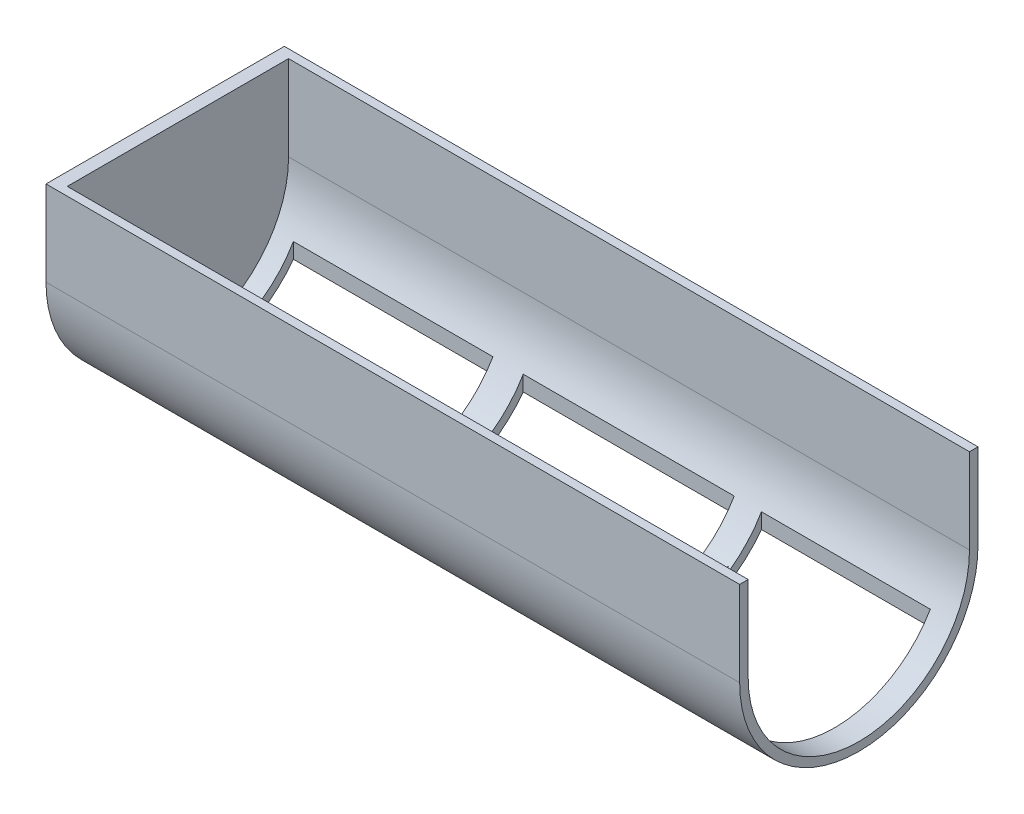
ISO-10303-21;
HEADER;
FILE_DESCRIPTION(('STEP AP214'),'2;1');
FILE_NAME('part.step','',(''),(''),'','','');
FILE_SCHEMA(('AUTOMOTIVE_DESIGN { 1 0 10303 214 1 1 1 1 }'));
ENDSEC;
DATA;
#1=APPLICATION_CONTEXT('core data for automotive mechanical design processes');
#2=APPLICATION_PROTOCOL_DEFINITION('international standard','automotive_design',2000,#1);
#3=PRODUCT_CONTEXT('',#1,'mechanical');
#4=PRODUCT('Part','Part','',(#3));
#5=PRODUCT_RELATED_PRODUCT_CATEGORY('part','',(#4));
#6=PRODUCT_DEFINITION_FORMATION('','',#4);
#7=PRODUCT_DEFINITION_CONTEXT('part definition',#1,'design');
#8=PRODUCT_DEFINITION('design','',#6,#7);
#9=PRODUCT_DEFINITION_SHAPE('','',#8);
#10=(LENGTH_UNIT() NAMED_UNIT(*) SI_UNIT(.MILLI.,.METRE.));
#11=(NAMED_UNIT(*) PLANE_ANGLE_UNIT() SI_UNIT($,.RADIAN.));
#12=(NAMED_UNIT(*) SI_UNIT($,.STERADIAN.) SOLID_ANGLE_UNIT());
#13=UNCERTAINTY_MEASURE_WITH_UNIT(LENGTH_MEASURE(1.E-05),#10,'distance_accuracy_value','');
#14=(GEOMETRIC_REPRESENTATION_CONTEXT(3) GLOBAL_UNCERTAINTY_ASSIGNED_CONTEXT((#13)) GLOBAL_UNIT_ASSIGNED_CONTEXT((#10,
#11,#12)) REPRESENTATION_CONTEXT('',''));
#15=CARTESIAN_POINT('',(0.,0.,0.));
#16=DIRECTION('',(0.,0.,1.));
#17=DIRECTION('',(1.,0.,0.));
#18=AXIS2_PLACEMENT_3D('',#15,#16,#17);
#19=CARTESIAN_POINT('',(160.,20.,-28.));
#20=DIRECTION('',(0.,0.,1.));
#21=DIRECTION('',(0.,-1.,0.));
#22=AXIS2_PLACEMENT_3D('',#19,#20,#21);
#23=PLANE('',#22);
#24=DIRECTION('',(-1.,0.,0.));
#25=VECTOR('',#24,1.);
#26=CARTESIAN_POINT('',(160.,0.,-28.));
#27=LINE('',#26,#25);
#28=CARTESIAN_POINT('',(160.,0.,-28.));
#29=VERTEX_POINT('',#28);
#30=CARTESIAN_POINT('',(-3.,0.,-28.));
#31=VERTEX_POINT('',#30);
#32=EDGE_CURVE('E345',#29,#31,#27,.T.);
#33=ORIENTED_EDGE('',*,*,#32,.T.);
#34=DIRECTION('',(0.,-1.,0.));
#35=VECTOR('',#34,1.);
#36=CARTESIAN_POINT('',(-3.,20.,-28.));
#37=LINE('',#36,#35);
#38=CARTESIAN_POINT('',(-3.,20.,-28.));
#39=VERTEX_POINT('',#38);
#40=EDGE_CURVE('E295',#39,#31,#37,.T.);
#41=ORIENTED_EDGE('',*,*,#40,.F.);
#42=DIRECTION('',(-1.,0.,0.));
#43=VECTOR('',#42,1.);
#44=CARTESIAN_POINT('',(160.,20.,-28.));
#45=LINE('',#44,#43);
#46=CARTESIAN_POINT('',(160.,20.,-28.));
#47=VERTEX_POINT('',#46);
#48=EDGE_CURVE('E307',#47,#39,#45,.T.);
#49=ORIENTED_EDGE('',*,*,#48,.F.);
#50=DIRECTION('',(0.,-1.,0.));
#51=VECTOR('',#50,1.);
#52=CARTESIAN_POINT('',(160.,20.,-28.));
#53=LINE('',#52,#51);
#54=EDGE_CURVE('E314',#47,#29,#53,.T.);
#55=ORIENTED_EDGE('',*,*,#54,.T.);
#56=EDGE_LOOP('',(#33,#41,#49,#55));
#57=FACE_BOUND('',#56,.T.);
#58=ADVANCED_FACE('F39',(#57),#23,.F.);
#59=CARTESIAN_POINT('',(0.,20.,-26.));
#60=DIRECTION('',(0.,0.,-1.));
#61=DIRECTION('',(0.,1.,0.));
#62=AXIS2_PLACEMENT_3D('',#59,#60,#61);
#63=PLANE('',#62);
#64=DIRECTION('',(-1.,0.,0.));
#65=VECTOR('',#64,1.);
#66=CARTESIAN_POINT('',(160.,0.,-26.));
#67=LINE('',#66,#65);
#68=CARTESIAN_POINT('',(160.,0.,-26.));
#69=VERTEX_POINT('',#68);
#70=CARTESIAN_POINT('',(0.,0.,-26.));
#71=VERTEX_POINT('',#70);
#72=EDGE_CURVE('E341',#69,#71,#67,.T.);
#73=ORIENTED_EDGE('',*,*,#72,.F.);
#74=DIRECTION('',(0.,-1.,0.));
#75=VECTOR('',#74,1.);
#76=CARTESIAN_POINT('',(160.,20.,-26.));
#77=LINE('',#76,#75);
#78=CARTESIAN_POINT('',(160.,20.,-26.));
#79=VERTEX_POINT('',#78);
#80=EDGE_CURVE('E320',#79,#69,#77,.T.);
#81=ORIENTED_EDGE('',*,*,#80,.F.);
#82=DIRECTION('',(1.,0.,0.));
#83=VECTOR('',#82,1.);
#84=CARTESIAN_POINT('',(0.,20.,-26.));
#85=LINE('',#84,#83);
#86=CARTESIAN_POINT('',(0.,20.,-26.));
#87=VERTEX_POINT('',#86);
#88=EDGE_CURVE('E310',#87,#79,#85,.T.);
#89=ORIENTED_EDGE('',*,*,#88,.F.);
#90=DIRECTION('',(0.,-1.,0.));
#91=VECTOR('',#90,1.);
#92=CARTESIAN_POINT('',(0.,20.,-26.));
#93=LINE('',#92,#91);
#94=EDGE_CURVE('E319',#87,#71,#93,.T.);
#95=ORIENTED_EDGE('',*,*,#94,.T.);
#96=EDGE_LOOP('',(#73,#81,#89,#95));
#97=FACE_BOUND('',#96,.T.);
#98=ADVANCED_FACE('F378',(#97),#63,.F.);
#99=CARTESIAN_POINT('',(0.,20.,0.));
#100=DIRECTION('',(0.,1.,0.));
#101=DIRECTION('',(0.,0.,1.));
#102=AXIS2_PLACEMENT_3D('',#99,#100,#101);
#103=PLANE('',#102);
#104=ORIENTED_EDGE('',*,*,#48,.T.);
#105=DIRECTION('',(0.,0.,-1.));
#106=VECTOR('',#105,1.);
#107=CARTESIAN_POINT('',(-3.,20.,-28.));
#108=LINE('',#107,#106);
#109=CARTESIAN_POINT('',(-3.,20.,28.));
#110=VERTEX_POINT('',#109);
#111=EDGE_CURVE('E301',#110,#39,#108,.T.);
#112=ORIENTED_EDGE('',*,*,#111,.F.);
#113=DIRECTION('',(1.,0.,0.));
#114=VECTOR('',#113,1.);
#115=CARTESIAN_POINT('',(0.,20.,28.));
#116=LINE('',#115,#114);
#117=CARTESIAN_POINT('',(160.,20.,28.));
#118=VERTEX_POINT('',#117);
#119=EDGE_CURVE('E331',#110,#118,#116,.T.);
#120=ORIENTED_EDGE('',*,*,#119,.T.);
#121=DIRECTION('',(0.,0.,-1.));
#122=VECTOR('',#121,1.);
#123=CARTESIAN_POINT('',(160.,20.,28.));
#124=LINE('',#123,#122);
#125=CARTESIAN_POINT('',(160.,20.,26.));
#126=VERTEX_POINT('',#125);
#127=EDGE_CURVE('E335',#118,#126,#124,.T.);
#128=ORIENTED_EDGE('',*,*,#127,.T.);
#129=DIRECTION('',(-1.,0.,0.));
#130=VECTOR('',#129,1.);
#131=CARTESIAN_POINT('',(160.,20.,26.));
#132=LINE('',#131,#130);
#133=CARTESIAN_POINT('',(0.,20.,26.));
#134=VERTEX_POINT('',#133);
#135=EDGE_CURVE('E309',#126,#134,#132,.T.);
#136=ORIENTED_EDGE('',*,*,#135,.T.);
#137=DIRECTION('',(0.,0.,-1.));
#138=VECTOR('',#137,1.);
#139=CARTESIAN_POINT('',(0.,20.,-28.));
#140=LINE('',#139,#138);
#141=EDGE_CURVE('E292',#134,#87,#140,.T.);
#142=ORIENTED_EDGE('',*,*,#141,.T.);
#143=ORIENTED_EDGE('',*,*,#88,.T.);
#144=DIRECTION('',(0.,0.,-1.));
#145=VECTOR('',#144,1.);
#146=CARTESIAN_POINT('',(160.,20.,-26.));
#147=LINE('',#146,#145);
#148=EDGE_CURVE('E315',#79,#47,#147,.T.);
#149=ORIENTED_EDGE('',*,*,#148,.T.);
#150=EDGE_LOOP('',(#104,#112,#120,#128,#136,#142,#143,#149));
#151=FACE_BOUND('',#150,.T.);
#152=ADVANCED_FACE('F359',(#151),#103,.T.);
#153=CARTESIAN_POINT('',(160.,0.,0.));
#154=DIRECTION('',(-1.,0.,0.));
#155=DIRECTION('',(0.,0.,1.));
#156=AXIS2_PLACEMENT_3D('',#153,#154,#155);
#157=CYLINDRICAL_SURFACE('',#156,26.);
#158=DIRECTION('',(-1.,0.,0.));
#159=VECTOR('',#158,1.);
#160=CARTESIAN_POINT('',(160.,-17.7523013973817,18.9962047550694));
#161=LINE('',#160,#159);
#162=CARTESIAN_POINT('',(51.5610081041127,-17.7523013973817,18.9962047550694));
#163=VERTEX_POINT('',#162);
#164=CARTESIAN_POINT('',(4.67329362693053,-17.7523013973817,18.9962047550694));
#165=VERTEX_POINT('',#164);
#166=EDGE_CURVE('E285',#163,#165,#161,.T.);
#167=ORIENTED_EDGE('',*,*,#166,.T.);
#168=CARTESIAN_POINT('',(4.67329362693053,0.,0.));
#169=DIRECTION('',(-1.,0.,0.));
#170=DIRECTION('',(0.,0.,1.));
#171=AXIS2_PLACEMENT_3D('',#168,#169,#170);
#172=CIRCLE('',#171,26.);
#173=CARTESIAN_POINT('',(4.67329362693053,-13.1088285569375,-22.4534766542916));
#174=VERTEX_POINT('',#173);
#175=EDGE_CURVE('E288',#165,#174,#172,.F.);
#176=ORIENTED_EDGE('',*,*,#175,.T.);
#177=DIRECTION('',(-1.,0.,0.));
#178=VECTOR('',#177,1.);
#179=CARTESIAN_POINT('',(160.,-13.1088285569375,-22.4534766542916));
#180=LINE('',#179,#178);
#181=CARTESIAN_POINT('',(51.5610081041127,-13.1088285569375,-22.4534766542916));
#182=VERTEX_POINT('',#181);
#183=EDGE_CURVE('E240',#174,#182,#180,.F.);
#184=ORIENTED_EDGE('',*,*,#183,.T.);
#185=CARTESIAN_POINT('',(51.5610081041127,0.,0.));
#186=DIRECTION('',(1.,0.,0.));
#187=DIRECTION('',(0.,0.,-1.));
#188=AXIS2_PLACEMENT_3D('',#185,#186,#187);
#189=CIRCLE('',#188,26.);
#190=EDGE_CURVE('E282',#182,#163,#189,.F.);
#191=ORIENTED_EDGE('',*,*,#190,.T.);
#192=EDGE_LOOP('',(#167,#176,#184,#191));
#193=FACE_BOUND('',#192,.T.);
#194=DIRECTION('',(-1.,0.,0.));
#195=VECTOR('',#194,1.);
#196=CARTESIAN_POINT('',(160.,-19.4582586934642,17.2445982446163));
#197=LINE('',#196,#195);
#198=CARTESIAN_POINT('',(108.261305138329,-19.4582586934642,17.2445982446163));
#199=VERTEX_POINT('',#198);
#200=CARTESIAN_POINT('',(58.6829738542936,-19.4582586934642,17.2445982446163));
#201=VERTEX_POINT('',#200);
#202=EDGE_CURVE('E269',#199,#201,#197,.T.);
#203=ORIENTED_EDGE('',*,*,#202,.T.);
#204=CARTESIAN_POINT('',(58.6829738542936,0.,0.));
#205=DIRECTION('',(-1.,0.,0.));
#206=DIRECTION('',(0.,0.,1.));
#207=AXIS2_PLACEMENT_3D('',#204,#205,#206);
#208=CIRCLE('',#207,26.);
#209=CARTESIAN_POINT('',(58.6829738542936,-13.1088285569375,-22.4534766542916));
#210=VERTEX_POINT('',#209);
#211=EDGE_CURVE('E276',#201,#210,#208,.F.);
#212=ORIENTED_EDGE('',*,*,#211,.T.);
#213=DIRECTION('',(-1.,0.,0.));
#214=VECTOR('',#213,1.);
#215=CARTESIAN_POINT('',(160.,-13.1088285569375,-22.4534766542916));
#216=LINE('',#215,#214);
#217=CARTESIAN_POINT('',(108.261305138329,-13.1088285569375,-22.4534766542916));
#218=VERTEX_POINT('',#217);
#219=EDGE_CURVE('E277',#210,#218,#216,.F.);
#220=ORIENTED_EDGE('',*,*,#219,.T.);
#221=CARTESIAN_POINT('',(108.261305138329,0.,0.));
#222=DIRECTION('',(1.,0.,0.));
#223=DIRECTION('',(0.,0.,-1.));
#224=AXIS2_PLACEMENT_3D('',#221,#222,#223);
#225=CIRCLE('',#224,26.);
#226=EDGE_CURVE('E272',#218,#199,#225,.F.);
#227=ORIENTED_EDGE('',*,*,#226,.T.);
#228=EDGE_LOOP('',(#203,#212,#220,#227));
#229=FACE_BOUND('',#228,.T.);
#230=DIRECTION('',(-1.,0.,0.));
#231=VECTOR('',#230,1.);
#232=CARTESIAN_POINT('',(160.,-19.4582586934642,17.2445982446163));
#233=LINE('',#232,#231);
#234=CARTESIAN_POINT('',(154.336094741491,-19.4582586934642,17.2445982446163));
#235=VERTEX_POINT('',#234);
#236=CARTESIAN_POINT('',(114.662480161135,-19.4582586934642,17.2445982446163));
#237=VERTEX_POINT('',#236);
#238=EDGE_CURVE('E236',#235,#237,#233,.T.);
#239=ORIENTED_EDGE('',*,*,#238,.T.);
#240=CARTESIAN_POINT('',(114.662480161135,0.,0.));
#241=DIRECTION('',(-1.,0.,0.));
#242=DIRECTION('',(0.,0.,1.));
#243=AXIS2_PLACEMENT_3D('',#240,#241,#242);
#244=CIRCLE('',#243,26.);
#245=CARTESIAN_POINT('',(114.662480161135,-13.1088285569375,-22.4534766542916));
#246=VERTEX_POINT('',#245);
#247=EDGE_CURVE('E193',#237,#246,#244,.F.);
#248=ORIENTED_EDGE('',*,*,#247,.T.);
#249=DIRECTION('',(-1.,0.,0.));
#250=VECTOR('',#249,1.);
#251=CARTESIAN_POINT('',(160.,-13.1088285569375,-22.4534766542916));
#252=LINE('',#251,#250);
#253=CARTESIAN_POINT('',(154.336094741491,-13.1088285569375,-22.4534766542916));
#254=VERTEX_POINT('',#253);
#255=EDGE_CURVE('E266',#246,#254,#252,.F.);
#256=ORIENTED_EDGE('',*,*,#255,.T.);
#257=CARTESIAN_POINT('',(154.336094741491,0.,0.));
#258=DIRECTION('',(1.,0.,0.));
#259=DIRECTION('',(0.,0.,-1.));
#260=AXIS2_PLACEMENT_3D('',#257,#258,#259);
#261=CIRCLE('',#260,26.);
#262=EDGE_CURVE('E243',#254,#235,#261,.F.);
#263=ORIENTED_EDGE('',*,*,#262,.T.);
#264=EDGE_LOOP('',(#239,#248,#256,#263));
#265=FACE_BOUND('',#264,.T.);
#266=CARTESIAN_POINT('',(0.,0.,0.));
#267=DIRECTION('',(-1.,0.,0.));
#268=DIRECTION('',(0.,0.,1.));
#269=AXIS2_PLACEMENT_3D('',#266,#267,#268);
#270=CIRCLE('',#269,26.);
#271=CARTESIAN_POINT('',(0.,0.,26.));
#272=VERTEX_POINT('',#271);
#273=EDGE_CURVE('E323',#71,#272,#270,.T.);
#274=ORIENTED_EDGE('',*,*,#273,.T.);
#275=DIRECTION('',(-1.,0.,0.));
#276=VECTOR('',#275,1.);
#277=CARTESIAN_POINT('',(160.,0.,26.));
#278=LINE('',#277,#276);
#279=CARTESIAN_POINT('',(160.,0.,26.));
#280=VERTEX_POINT('',#279);
#281=EDGE_CURVE('E349',#280,#272,#278,.T.);
#282=ORIENTED_EDGE('',*,*,#281,.F.);
#283=CARTESIAN_POINT('',(160.,0.,0.));
#284=DIRECTION('',(-1.,0.,0.));
#285=DIRECTION('',(0.,0.,1.));
#286=AXIS2_PLACEMENT_3D('',#283,#284,#285);
#287=CIRCLE('',#286,26.);
#288=EDGE_CURVE('E340',#69,#280,#287,.T.);
#289=ORIENTED_EDGE('',*,*,#288,.F.);
#290=ORIENTED_EDGE('',*,*,#72,.T.);
#291=EDGE_LOOP('',(#274,#282,#289,#290));
#292=FACE_BOUND('',#291,.T.);
#293=ADVANCED_FACE('F41',(#193,#229,#265,#292),#157,.F.);
#294=CARTESIAN_POINT('',(160.,0.,0.));
#295=DIRECTION('',(-1.,0.,0.));
#296=DIRECTION('',(0.,0.,1.));
#297=AXIS2_PLACEMENT_3D('',#294,#295,#296);
#298=CYLINDRICAL_SURFACE('',#297,28.);
#299=DIRECTION('',(-1.,0.,0.));
#300=VECTOR('',#299,1.);
#301=CARTESIAN_POINT('',(160.,-20.5704692436385,18.9962047550694));
#302=LINE('',#301,#300);
#303=CARTESIAN_POINT('',(4.67329362693053,-20.5704692436385,18.9962047550694));
#304=VERTEX_POINT('',#303);
#305=CARTESIAN_POINT('',(51.5610081041127,-20.5704692436385,18.9962047550694));
#306=VERTEX_POINT('',#305);
#307=EDGE_CURVE('E11',#304,#306,#302,.F.);
#308=ORIENTED_EDGE('',*,*,#307,.T.);
#309=CARTESIAN_POINT('',(51.5610081041127,0.,0.));
#310=DIRECTION('',(1.,0.,0.));
#311=DIRECTION('',(0.,0.,-1.));
#312=AXIS2_PLACEMENT_3D('',#309,#310,#311);
#313=CIRCLE('',#312,28.);
#314=CARTESIAN_POINT('',(51.5610081041127,-16.7284603635595,-22.4534766542916));
#315=VERTEX_POINT('',#314);
#316=EDGE_CURVE('E217',#306,#315,#313,.T.);
#317=ORIENTED_EDGE('',*,*,#316,.T.);
#318=DIRECTION('',(-1.,0.,0.));
#319=VECTOR('',#318,1.);
#320=CARTESIAN_POINT('',(160.,-16.7284603635595,-22.4534766542916));
#321=LINE('',#320,#319);
#322=CARTESIAN_POINT('',(4.67329362693053,-16.7284603635595,-22.4534766542916));
#323=VERTEX_POINT('',#322);
#324=EDGE_CURVE('E222',#315,#323,#321,.T.);
#325=ORIENTED_EDGE('',*,*,#324,.T.);
#326=CARTESIAN_POINT('',(4.67329362693053,0.,0.));
#327=DIRECTION('',(-1.,0.,0.));
#328=DIRECTION('',(0.,0.,1.));
#329=AXIS2_PLACEMENT_3D('',#326,#327,#328);
#330=CIRCLE('',#329,28.);
#331=EDGE_CURVE('E50',#323,#304,#330,.T.);
#332=ORIENTED_EDGE('',*,*,#331,.T.);
#333=EDGE_LOOP('',(#308,#317,#325,#332));
#334=FACE_BOUND('',#333,.T.);
#335=DIRECTION('',(-1.,0.,0.));
#336=VECTOR('',#335,1.);
#337=CARTESIAN_POINT('',(160.,-22.0595519306666,17.2445982446164));
#338=LINE('',#337,#336);
#339=CARTESIAN_POINT('',(58.6829738542936,-22.0595519306666,17.2445982446163));
#340=VERTEX_POINT('',#339);
#341=CARTESIAN_POINT('',(108.261305138329,-22.0595519306666,17.2445982446164));
#342=VERTEX_POINT('',#341);
#343=EDGE_CURVE('E214',#340,#342,#338,.F.);
#344=ORIENTED_EDGE('',*,*,#343,.T.);
#345=CARTESIAN_POINT('',(108.261305138329,0.,0.));
#346=DIRECTION('',(1.,0.,0.));
#347=DIRECTION('',(0.,0.,-1.));
#348=AXIS2_PLACEMENT_3D('',#345,#346,#347);
#349=CIRCLE('',#348,28.);
#350=CARTESIAN_POINT('',(108.261305138329,-16.7284603635595,-22.4534766542916));
#351=VERTEX_POINT('',#350);
#352=EDGE_CURVE('E188',#342,#351,#349,.T.);
#353=ORIENTED_EDGE('',*,*,#352,.T.);
#354=DIRECTION('',(-1.,0.,0.));
#355=VECTOR('',#354,1.);
#356=CARTESIAN_POINT('',(160.,-16.7284603635595,-22.4534766542916));
#357=LINE('',#356,#355);
#358=CARTESIAN_POINT('',(58.6829738542936,-16.7284603635595,-22.4534766542916));
#359=VERTEX_POINT('',#358);
#360=EDGE_CURVE('E207',#351,#359,#357,.T.);
#361=ORIENTED_EDGE('',*,*,#360,.T.);
#362=CARTESIAN_POINT('',(58.6829738542936,0.,0.));
#363=DIRECTION('',(-1.,0.,0.));
#364=DIRECTION('',(0.,0.,1.));
#365=AXIS2_PLACEMENT_3D('',#362,#363,#364);
#366=CIRCLE('',#365,28.);
#367=EDGE_CURVE('E215',#359,#340,#366,.T.);
#368=ORIENTED_EDGE('',*,*,#367,.T.);
#369=EDGE_LOOP('',(#344,#353,#361,#368));
#370=FACE_BOUND('',#369,.T.);
#371=DIRECTION('',(-1.,0.,0.));
#372=VECTOR('',#371,1.);
#373=CARTESIAN_POINT('',(160.,-22.0595519306666,17.2445982446164));
#374=LINE('',#373,#372);
#375=CARTESIAN_POINT('',(114.662480161135,-22.0595519306666,17.2445982446163));
#376=VERTEX_POINT('',#375);
#377=CARTESIAN_POINT('',(154.336094741491,-22.0595519306666,17.2445982446164));
#378=VERTEX_POINT('',#377);
#379=EDGE_CURVE('E176',#376,#378,#374,.F.);
#380=ORIENTED_EDGE('',*,*,#379,.T.);
#381=CARTESIAN_POINT('',(154.336094741491,0.,0.));
#382=DIRECTION('',(1.,0.,0.));
#383=DIRECTION('',(0.,0.,-1.));
#384=AXIS2_PLACEMENT_3D('',#381,#382,#383);
#385=CIRCLE('',#384,28.);
#386=CARTESIAN_POINT('',(154.336094741491,-16.7284603635595,-22.4534766542916));
#387=VERTEX_POINT('',#386);
#388=EDGE_CURVE('E201',#378,#387,#385,.T.);
#389=ORIENTED_EDGE('',*,*,#388,.T.);
#390=DIRECTION('',(-1.,0.,0.));
#391=VECTOR('',#390,1.);
#392=CARTESIAN_POINT('',(160.,-16.7284603635595,-22.4534766542916));
#393=LINE('',#392,#391);
#394=CARTESIAN_POINT('',(114.662480161135,-16.7284603635595,-22.4534766542916));
#395=VERTEX_POINT('',#394);
#396=EDGE_CURVE('E203',#387,#395,#393,.T.);
#397=ORIENTED_EDGE('',*,*,#396,.T.);
#398=CARTESIAN_POINT('',(114.662480161135,0.,0.));
#399=DIRECTION('',(-1.,0.,0.));
#400=DIRECTION('',(0.,0.,1.));
#401=AXIS2_PLACEMENT_3D('',#398,#399,#400);
#402=CIRCLE('',#401,28.);
#403=EDGE_CURVE('E190',#395,#376,#402,.T.);
#404=ORIENTED_EDGE('',*,*,#403,.T.);
#405=EDGE_LOOP('',(#380,#389,#397,#404));
#406=FACE_BOUND('',#405,.T.);
#407=DIRECTION('',(-1.,0.,0.));
#408=VECTOR('',#407,1.);
#409=CARTESIAN_POINT('',(160.,0.,28.));
#410=LINE('',#409,#408);
#411=CARTESIAN_POINT('',(160.,0.,28.));
#412=VERTEX_POINT('',#411);
#413=CARTESIAN_POINT('',(-3.,0.,28.));
#414=VERTEX_POINT('',#413);
#415=EDGE_CURVE('E350',#412,#414,#410,.T.);
#416=ORIENTED_EDGE('',*,*,#415,.T.);
#417=CARTESIAN_POINT('',(-3.,0.,0.));
#418=DIRECTION('',(-1.,0.,0.));
#419=DIRECTION('',(0.,0.,1.));
#420=AXIS2_PLACEMENT_3D('',#417,#418,#419);
#421=CIRCLE('',#420,28.);
#422=EDGE_CURVE('E293',#31,#414,#421,.T.);
#423=ORIENTED_EDGE('',*,*,#422,.F.);
#424=ORIENTED_EDGE('',*,*,#32,.F.);
#425=CARTESIAN_POINT('',(160.,0.,0.));
#426=DIRECTION('',(1.,0.,0.));
#427=DIRECTION('',(0.,0.,1.));
#428=AXIS2_PLACEMENT_3D('',#425,#426,#427);
#429=CIRCLE('',#428,28.);
#430=EDGE_CURVE('E339',#412,#29,#429,.T.);
#431=ORIENTED_EDGE('',*,*,#430,.F.);
#432=EDGE_LOOP('',(#416,#423,#424,#431));
#433=FACE_BOUND('',#432,.T.);
#434=ADVANCED_FACE('F200',(#334,#370,#406,#433),#298,.T.);
#435=CARTESIAN_POINT('',(160.,0.,0.));
#436=DIRECTION('',(-1.,0.,0.));
#437=DIRECTION('',(0.,0.,1.));
#438=AXIS2_PLACEMENT_3D('',#435,#436,#437);
#439=PLANE('',#438);
#440=ORIENTED_EDGE('',*,*,#288,.T.);
#441=DIRECTION('',(0.,-1.,0.));
#442=VECTOR('',#441,1.);
#443=CARTESIAN_POINT('',(160.,20.,26.));
#444=LINE('',#443,#442);
#445=EDGE_CURVE('E328',#126,#280,#444,.T.);
#446=ORIENTED_EDGE('',*,*,#445,.F.);
#447=ORIENTED_EDGE('',*,*,#127,.F.);
#448=DIRECTION('',(0.,-1.,0.));
#449=VECTOR('',#448,1.);
#450=CARTESIAN_POINT('',(160.,20.,28.));
#451=LINE('',#450,#449);
#452=EDGE_CURVE('E326',#118,#412,#451,.T.);
#453=ORIENTED_EDGE('',*,*,#452,.T.);
#454=ORIENTED_EDGE('',*,*,#430,.T.);
#455=ORIENTED_EDGE('',*,*,#54,.F.);
#456=ORIENTED_EDGE('',*,*,#148,.F.);
#457=ORIENTED_EDGE('',*,*,#80,.T.);
#458=EDGE_LOOP('',(#440,#446,#447,#453,#454,#455,#456,#457));
#459=FACE_BOUND('',#458,.T.);
#460=ADVANCED_FACE('F372',(#459),#439,.F.);
#461=CARTESIAN_POINT('',(160.,20.,26.));
#462=DIRECTION('',(0.,0.,1.));
#463=DIRECTION('',(0.,-1.,0.));
#464=AXIS2_PLACEMENT_3D('',#461,#462,#463);
#465=PLANE('',#464);
#466=ORIENTED_EDGE('',*,*,#281,.T.);
#467=DIRECTION('',(0.,-1.,0.));
#468=VECTOR('',#467,1.);
#469=CARTESIAN_POINT('',(0.,20.,26.));
#470=LINE('',#469,#468);
#471=EDGE_CURVE('E303',#134,#272,#470,.T.);
#472=ORIENTED_EDGE('',*,*,#471,.F.);
#473=ORIENTED_EDGE('',*,*,#135,.F.);
#474=ORIENTED_EDGE('',*,*,#445,.T.);
#475=EDGE_LOOP('',(#466,#472,#473,#474));
#476=FACE_BOUND('',#475,.T.);
#477=ADVANCED_FACE('F367',(#476),#465,.F.);
#478=CARTESIAN_POINT('',(0.,20.,28.));
#479=DIRECTION('',(0.,0.,-1.));
#480=DIRECTION('',(0.,1.,0.));
#481=AXIS2_PLACEMENT_3D('',#478,#479,#480);
#482=PLANE('',#481);
#483=ORIENTED_EDGE('',*,*,#415,.F.);
#484=ORIENTED_EDGE('',*,*,#452,.F.);
#485=ORIENTED_EDGE('',*,*,#119,.F.);
#486=DIRECTION('',(0.,1.,0.));
#487=VECTOR('',#486,1.);
#488=CARTESIAN_POINT('',(-3.,20.,28.));
#489=LINE('',#488,#487);
#490=EDGE_CURVE('E296',#414,#110,#489,.T.);
#491=ORIENTED_EDGE('',*,*,#490,.F.);
#492=EDGE_LOOP('',(#483,#484,#485,#491));
#493=FACE_BOUND('',#492,.T.);
#494=ADVANCED_FACE('F384',(#493),#482,.F.);
#495=CARTESIAN_POINT('',(-3.,0.,0.));
#496=DIRECTION('',(-1.,0.,0.));
#497=DIRECTION('',(0.,0.,1.));
#498=AXIS2_PLACEMENT_3D('',#495,#496,#497);
#499=PLANE('',#498);
#500=ORIENTED_EDGE('',*,*,#40,.T.);
#501=ORIENTED_EDGE('',*,*,#422,.T.);
#502=ORIENTED_EDGE('',*,*,#490,.T.);
#503=ORIENTED_EDGE('',*,*,#111,.T.);
#504=EDGE_LOOP('',(#500,#501,#502,#503));
#505=FACE_BOUND('',#504,.T.);
#506=ADVANCED_FACE('F391',(#505),#499,.T.);
#507=CARTESIAN_POINT('',(0.,0.,0.));
#508=DIRECTION('',(-1.,0.,0.));
#509=DIRECTION('',(0.,0.,1.));
#510=AXIS2_PLACEMENT_3D('',#507,#508,#509);
#511=PLANE('',#510);
#512=ORIENTED_EDGE('',*,*,#94,.F.);
#513=ORIENTED_EDGE('',*,*,#141,.F.);
#514=ORIENTED_EDGE('',*,*,#471,.T.);
#515=ORIENTED_EDGE('',*,*,#273,.F.);
#516=EDGE_LOOP('',(#512,#513,#514,#515));
#517=FACE_BOUND('',#516,.T.);
#518=ADVANCED_FACE('F370',(#517),#511,.F.);
#519=CARTESIAN_POINT('',(114.662480161135,-28.,17.2445982446164));
#520=DIRECTION('',(-1.,0.,0.));
#521=DIRECTION('',(0.,0.,1.));
#522=AXIS2_PLACEMENT_3D('',#519,#520,#521);
#523=PLANE('',#522);
#524=DIRECTION('',(0.,1.,0.));
#525=VECTOR('',#524,1.);
#526=CARTESIAN_POINT('',(114.662480161135,-28.,17.2445982446164));
#527=LINE('',#526,#525);
#528=EDGE_CURVE('E178',#376,#237,#527,.T.);
#529=ORIENTED_EDGE('',*,*,#528,.F.);
#530=ORIENTED_EDGE('',*,*,#403,.F.);
#531=DIRECTION('',(0.,1.,0.));
#532=VECTOR('',#531,1.);
#533=CARTESIAN_POINT('',(114.662480161135,-28.0000000000001,-22.4534766542916));
#534=LINE('',#533,#532);
#535=EDGE_CURVE('E265',#395,#246,#534,.T.);
#536=ORIENTED_EDGE('',*,*,#535,.T.);
#537=ORIENTED_EDGE('',*,*,#247,.F.);
#538=EDGE_LOOP('',(#529,#530,#536,#537));
#539=FACE_BOUND('',#538,.T.);
#540=ADVANCED_FACE('F187',(#539),#523,.F.);
#541=CARTESIAN_POINT('',(114.662480161135,-28.0000000000001,-22.4534766542916));
#542=DIRECTION('',(0.,0.,-1.));
#543=DIRECTION('',(0.,1.,0.));
#544=AXIS2_PLACEMENT_3D('',#541,#542,#543);
#545=PLANE('',#544);
#546=ORIENTED_EDGE('',*,*,#535,.F.);
#547=ORIENTED_EDGE('',*,*,#396,.F.);
#548=DIRECTION('',(0.,1.,0.));
#549=VECTOR('',#548,1.);
#550=CARTESIAN_POINT('',(154.336094741491,-28.0000000000001,-22.4534766542916));
#551=LINE('',#550,#549);
#552=EDGE_CURVE('E259',#387,#254,#551,.T.);
#553=ORIENTED_EDGE('',*,*,#552,.T.);
#554=ORIENTED_EDGE('',*,*,#255,.F.);
#555=EDGE_LOOP('',(#546,#547,#553,#554));
#556=FACE_BOUND('',#555,.T.);
#557=ADVANCED_FACE('F354',(#556),#545,.F.);
#558=CARTESIAN_POINT('',(154.336094741491,-28.,17.2445982446164));
#559=DIRECTION('',(1.,0.,0.));
#560=DIRECTION('',(0.,0.,-1.));
#561=AXIS2_PLACEMENT_3D('',#558,#559,#560);
#562=PLANE('',#561);
#563=ORIENTED_EDGE('',*,*,#552,.F.);
#564=ORIENTED_EDGE('',*,*,#388,.F.);
#565=DIRECTION('',(0.,1.,0.));
#566=VECTOR('',#565,1.);
#567=CARTESIAN_POINT('',(154.336094741491,-28.,17.2445982446164));
#568=LINE('',#567,#566);
#569=EDGE_CURVE('E185',#378,#235,#568,.T.);
#570=ORIENTED_EDGE('',*,*,#569,.T.);
#571=ORIENTED_EDGE('',*,*,#262,.F.);
#572=EDGE_LOOP('',(#563,#564,#570,#571));
#573=FACE_BOUND('',#572,.T.);
#574=ADVANCED_FACE('F355',(#573),#562,.F.);
#575=CARTESIAN_POINT('',(114.662480161135,-28.,17.2445982446164));
#576=DIRECTION('',(0.,0.,1.));
#577=DIRECTION('',(0.,-1.,0.));
#578=AXIS2_PLACEMENT_3D('',#575,#576,#577);
#579=PLANE('',#578);
#580=ORIENTED_EDGE('',*,*,#569,.F.);
#581=ORIENTED_EDGE('',*,*,#379,.F.);
#582=ORIENTED_EDGE('',*,*,#528,.T.);
#583=ORIENTED_EDGE('',*,*,#238,.F.);
#584=EDGE_LOOP('',(#580,#581,#582,#583));
#585=FACE_BOUND('',#584,.T.);
#586=ADVANCED_FACE('F179',(#585),#579,.F.);
#587=CARTESIAN_POINT('',(58.6829738542936,-28.,17.2445982446164));
#588=DIRECTION('',(-1.,0.,0.));
#589=DIRECTION('',(0.,0.,1.));
#590=AXIS2_PLACEMENT_3D('',#587,#588,#589);
#591=PLANE('',#590);
#592=DIRECTION('',(0.,1.,0.));
#593=VECTOR('',#592,1.);
#594=CARTESIAN_POINT('',(58.6829738542936,-28.,17.2445982446164));
#595=LINE('',#594,#593);
#596=EDGE_CURVE('E65',#340,#201,#595,.T.);
#597=ORIENTED_EDGE('',*,*,#596,.F.);
#598=ORIENTED_EDGE('',*,*,#367,.F.);
#599=DIRECTION('',(0.,1.,0.));
#600=VECTOR('',#599,1.);
#601=CARTESIAN_POINT('',(58.6829738542936,-28.0000000000001,-22.4534766542916));
#602=LINE('',#601,#600);
#603=EDGE_CURVE('E198',#359,#210,#602,.T.);
#604=ORIENTED_EDGE('',*,*,#603,.T.);
#605=ORIENTED_EDGE('',*,*,#211,.F.);
#606=EDGE_LOOP('',(#597,#598,#604,#605));
#607=FACE_BOUND('',#606,.T.);
#608=ADVANCED_FACE('F449',(#607),#591,.F.);
#609=CARTESIAN_POINT('',(58.6829738542936,-28.0000000000001,-22.4534766542916));
#610=DIRECTION('',(0.,0.,-1.));
#611=DIRECTION('',(0.,1.,0.));
#612=AXIS2_PLACEMENT_3D('',#609,#610,#611);
#613=PLANE('',#612);
#614=ORIENTED_EDGE('',*,*,#603,.F.);
#615=ORIENTED_EDGE('',*,*,#360,.F.);
#616=DIRECTION('',(0.,1.,0.));
#617=VECTOR('',#616,1.);
#618=CARTESIAN_POINT('',(108.261305138329,-28.0000000000001,-22.4534766542916));
#619=LINE('',#618,#617);
#620=EDGE_CURVE('E251',#351,#218,#619,.T.);
#621=ORIENTED_EDGE('',*,*,#620,.T.);
#622=ORIENTED_EDGE('',*,*,#219,.F.);
#623=EDGE_LOOP('',(#614,#615,#621,#622));
#624=FACE_BOUND('',#623,.T.);
#625=ADVANCED_FACE('F460',(#624),#613,.F.);
#626=CARTESIAN_POINT('',(108.261305138329,-28.,17.2445982446164));
#627=DIRECTION('',(1.,0.,0.));
#628=DIRECTION('',(0.,0.,-1.));
#629=AXIS2_PLACEMENT_3D('',#626,#627,#628);
#630=PLANE('',#629);
#631=ORIENTED_EDGE('',*,*,#620,.F.);
#632=ORIENTED_EDGE('',*,*,#352,.F.);
#633=DIRECTION('',(0.,1.,0.));
#634=VECTOR('',#633,1.);
#635=CARTESIAN_POINT('',(108.261305138329,-28.,17.2445982446164));
#636=LINE('',#635,#634);
#637=EDGE_CURVE('E250',#342,#199,#636,.T.);
#638=ORIENTED_EDGE('',*,*,#637,.T.);
#639=ORIENTED_EDGE('',*,*,#226,.F.);
#640=EDGE_LOOP('',(#631,#632,#638,#639));
#641=FACE_BOUND('',#640,.T.);
#642=ADVANCED_FACE('F466',(#641),#630,.F.);
#643=CARTESIAN_POINT('',(58.6829738542936,-28.,17.2445982446164));
#644=DIRECTION('',(0.,0.,1.));
#645=DIRECTION('',(0.,-1.,0.));
#646=AXIS2_PLACEMENT_3D('',#643,#644,#645);
#647=PLANE('',#646);
#648=ORIENTED_EDGE('',*,*,#637,.F.);
#649=ORIENTED_EDGE('',*,*,#343,.F.);
#650=ORIENTED_EDGE('',*,*,#596,.T.);
#651=ORIENTED_EDGE('',*,*,#202,.F.);
#652=EDGE_LOOP('',(#648,#649,#650,#651));
#653=FACE_BOUND('',#652,.T.);
#654=ADVANCED_FACE('F474',(#653),#647,.F.);
#655=CARTESIAN_POINT('',(4.67329362693053,-28.,18.9962047550694));
#656=DIRECTION('',(-1.,0.,0.));
#657=DIRECTION('',(0.,0.,1.));
#658=AXIS2_PLACEMENT_3D('',#655,#656,#657);
#659=PLANE('',#658);
#660=DIRECTION('',(0.,1.,0.));
#661=VECTOR('',#660,1.);
#662=CARTESIAN_POINT('',(4.67329362693053,-28.,18.9962047550694));
#663=LINE('',#662,#661);
#664=EDGE_CURVE('E53',#304,#165,#663,.T.);
#665=ORIENTED_EDGE('',*,*,#664,.F.);
#666=ORIENTED_EDGE('',*,*,#331,.F.);
#667=DIRECTION('',(0.,1.,0.));
#668=VECTOR('',#667,1.);
#669=CARTESIAN_POINT('',(4.67329362693053,-28.0000000000001,-22.4534766542916));
#670=LINE('',#669,#668);
#671=EDGE_CURVE('E227',#323,#174,#670,.T.);
#672=ORIENTED_EDGE('',*,*,#671,.T.);
#673=ORIENTED_EDGE('',*,*,#175,.F.);
#674=EDGE_LOOP('',(#665,#666,#672,#673));
#675=FACE_BOUND('',#674,.T.);
#676=ADVANCED_FACE('F229',(#675),#659,.F.);
#677=CARTESIAN_POINT('',(4.67329362693053,-28.0000000000001,-22.4534766542916));
#678=DIRECTION('',(0.,0.,-1.));
#679=DIRECTION('',(0.,1.,0.));
#680=AXIS2_PLACEMENT_3D('',#677,#678,#679);
#681=PLANE('',#680);
#682=ORIENTED_EDGE('',*,*,#671,.F.);
#683=ORIENTED_EDGE('',*,*,#324,.F.);
#684=DIRECTION('',(0.,1.,0.));
#685=VECTOR('',#684,1.);
#686=CARTESIAN_POINT('',(51.5610081041127,-28.0000000000001,-22.4534766542916));
#687=LINE('',#686,#685);
#688=EDGE_CURVE('E239',#315,#182,#687,.T.);
#689=ORIENTED_EDGE('',*,*,#688,.T.);
#690=ORIENTED_EDGE('',*,*,#183,.F.);
#691=EDGE_LOOP('',(#682,#683,#689,#690));
#692=FACE_BOUND('',#691,.T.);
#693=ADVANCED_FACE('F234',(#692),#681,.F.);
#694=CARTESIAN_POINT('',(51.5610081041127,-28.,18.9962047550694));
#695=DIRECTION('',(1.,0.,0.));
#696=DIRECTION('',(0.,0.,-1.));
#697=AXIS2_PLACEMENT_3D('',#694,#695,#696);
#698=PLANE('',#697);
#699=ORIENTED_EDGE('',*,*,#688,.F.);
#700=ORIENTED_EDGE('',*,*,#316,.F.);
#701=DIRECTION('',(0.,1.,0.));
#702=VECTOR('',#701,1.);
#703=CARTESIAN_POINT('',(51.5610081041127,-28.,18.9962047550694));
#704=LINE('',#703,#702);
#705=EDGE_CURVE('E241',#306,#163,#704,.T.);
#706=ORIENTED_EDGE('',*,*,#705,.T.);
#707=ORIENTED_EDGE('',*,*,#190,.F.);
#708=EDGE_LOOP('',(#699,#700,#706,#707));
#709=FACE_BOUND('',#708,.T.);
#710=ADVANCED_FACE('F499',(#709),#698,.F.);
#711=CARTESIAN_POINT('',(4.67329362693053,-28.,18.9962047550694));
#712=DIRECTION('',(0.,0.,1.));
#713=DIRECTION('',(0.,-1.,0.));
#714=AXIS2_PLACEMENT_3D('',#711,#712,#713);
#715=PLANE('',#714);
#716=ORIENTED_EDGE('',*,*,#705,.F.);
#717=ORIENTED_EDGE('',*,*,#307,.F.);
#718=ORIENTED_EDGE('',*,*,#664,.T.);
#719=ORIENTED_EDGE('',*,*,#166,.F.);
#720=EDGE_LOOP('',(#716,#717,#718,#719));
#721=FACE_BOUND('',#720,.T.);
#722=ADVANCED_FACE('F506',(#721),#715,.F.);
#723=CLOSED_SHELL('',(#58,#98,#152,#293,#434,#460,#477,#494,#506,#518,#540,#557,#574,#586,#608,
#625,#642,#654,#676,#693,#710,#722));
#724=MANIFOLD_SOLID_BREP('B2',#723);
#725=ADVANCED_BREP_SHAPE_REPRESENTATION('',(#18,#724),#14);
#726=SHAPE_DEFINITION_REPRESENTATION(#9,#725);
ENDSEC;
END-ISO-10303-21;
